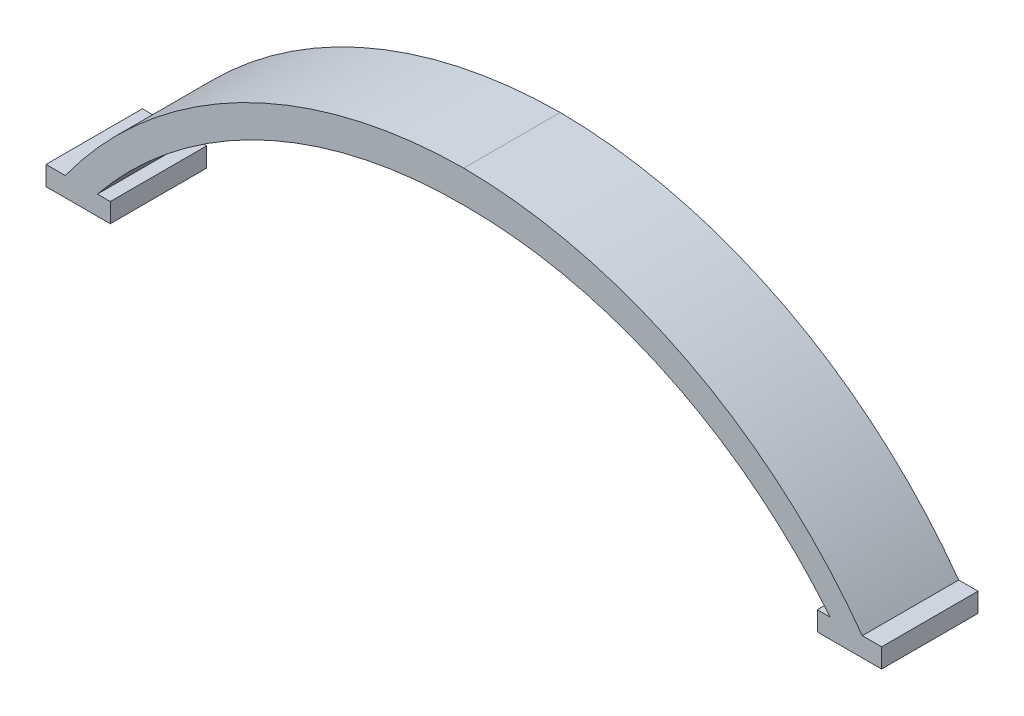
ISO-10303-21;
HEADER;
FILE_DESCRIPTION(('STEP AP214'),'2;1');
FILE_NAME('part.step','',(''),(''),'','','');
FILE_SCHEMA(('AUTOMOTIVE_DESIGN { 1 0 10303 214 1 1 1 1 }'));
ENDSEC;
DATA;
#1=APPLICATION_CONTEXT('core data for automotive mechanical design processes');
#2=APPLICATION_PROTOCOL_DEFINITION('international standard','automotive_design',2000,#1);
#3=PRODUCT_CONTEXT('',#1,'mechanical');
#4=PRODUCT('Part','Part','',(#3));
#5=PRODUCT_RELATED_PRODUCT_CATEGORY('part','',(#4));
#6=PRODUCT_DEFINITION_FORMATION('','',#4);
#7=PRODUCT_DEFINITION_CONTEXT('part definition',#1,'design');
#8=PRODUCT_DEFINITION('design','',#6,#7);
#9=PRODUCT_DEFINITION_SHAPE('','',#8);
#10=(LENGTH_UNIT() NAMED_UNIT(*) SI_UNIT(.MILLI.,.METRE.));
#11=(NAMED_UNIT(*) PLANE_ANGLE_UNIT() SI_UNIT($,.RADIAN.));
#12=(NAMED_UNIT(*) SI_UNIT($,.STERADIAN.) SOLID_ANGLE_UNIT());
#13=UNCERTAINTY_MEASURE_WITH_UNIT(LENGTH_MEASURE(1.E-05),#10,'distance_accuracy_value','');
#14=(GEOMETRIC_REPRESENTATION_CONTEXT(3) GLOBAL_UNCERTAINTY_ASSIGNED_CONTEXT((#13)) GLOBAL_UNIT_ASSIGNED_CONTEXT((#10,
#11,#12)) REPRESENTATION_CONTEXT('',''));
#15=CARTESIAN_POINT('',(0.,0.,0.));
#16=DIRECTION('',(0.,0.,1.));
#17=DIRECTION('',(1.,0.,0.));
#18=AXIS2_PLACEMENT_3D('',#15,#16,#17);
#19=CARTESIAN_POINT('',(0.,0.,19.05));
#20=DIRECTION('',(1.,0.,0.));
#21=DIRECTION('',(0.,0.,-1.));
#22=AXIS2_PLACEMENT_3D('',#19,#20,#21);
#23=PLANE('',#22);
#24=DIRECTION('',(0.,-1.,0.));
#25=VECTOR('',#24,1.);
#26=CARTESIAN_POINT('',(0.,0.,0.));
#27=LINE('',#26,#25);
#28=CARTESIAN_POINT('',(0.,3.81,0.));
#29=VERTEX_POINT('',#28);
#30=CARTESIAN_POINT('',(0.,0.,0.));
#31=VERTEX_POINT('',#30);
#32=EDGE_CURVE('E182',#29,#31,#27,.T.);
#33=ORIENTED_EDGE('',*,*,#32,.T.);
#34=DIRECTION('',(0.,0.,-1.));
#35=VECTOR('',#34,1.);
#36=CARTESIAN_POINT('',(0.,0.,19.05));
#37=LINE('',#36,#35);
#38=CARTESIAN_POINT('',(0.,0.,19.05));
#39=VERTEX_POINT('',#38);
#40=EDGE_CURVE('E11',#39,#31,#37,.T.);
#41=ORIENTED_EDGE('',*,*,#40,.F.);
#42=DIRECTION('',(0.,-1.,0.));
#43=VECTOR('',#42,1.);
#44=CARTESIAN_POINT('',(0.,0.,19.05));
#45=LINE('',#44,#43);
#46=CARTESIAN_POINT('',(0.,3.81,19.05));
#47=VERTEX_POINT('',#46);
#48=EDGE_CURVE('E222',#47,#39,#45,.T.);
#49=ORIENTED_EDGE('',*,*,#48,.F.);
#50=DIRECTION('',(0.,0.,-1.));
#51=VECTOR('',#50,1.);
#52=CARTESIAN_POINT('',(0.,3.81,19.05));
#53=LINE('',#52,#51);
#54=EDGE_CURVE('E178',#47,#29,#53,.T.);
#55=ORIENTED_EDGE('',*,*,#54,.T.);
#56=EDGE_LOOP('',(#33,#41,#49,#55));
#57=FACE_BOUND('',#56,.T.);
#58=ADVANCED_FACE('F45',(#57),#23,.F.);
#59=CARTESIAN_POINT('',(0.,0.,19.05));
#60=DIRECTION('',(0.,1.,0.));
#61=DIRECTION('',(0.,0.,1.));
#62=AXIS2_PLACEMENT_3D('',#59,#60,#61);
#63=PLANE('',#62);
#64=DIRECTION('',(1.,0.,0.));
#65=VECTOR('',#64,1.);
#66=CARTESIAN_POINT('',(0.,0.,0.));
#67=LINE('',#66,#65);
#68=CARTESIAN_POINT('',(12.7,0.,0.));
#69=VERTEX_POINT('',#68);
#70=EDGE_CURVE('E186',#31,#69,#67,.T.);
#71=ORIENTED_EDGE('',*,*,#70,.T.);
#72=DIRECTION('',(0.,0.,-1.));
#73=VECTOR('',#72,1.);
#74=CARTESIAN_POINT('',(12.7,0.,19.05));
#75=LINE('',#74,#73);
#76=CARTESIAN_POINT('',(12.7,0.,19.05));
#77=VERTEX_POINT('',#76);
#78=EDGE_CURVE('E54',#77,#69,#75,.T.);
#79=ORIENTED_EDGE('',*,*,#78,.F.);
#80=DIRECTION('',(1.,0.,0.));
#81=VECTOR('',#80,1.);
#82=CARTESIAN_POINT('',(0.,0.,19.05));
#83=LINE('',#82,#81);
#84=EDGE_CURVE('E123',#39,#77,#83,.T.);
#85=ORIENTED_EDGE('',*,*,#84,.F.);
#86=ORIENTED_EDGE('',*,*,#40,.T.);
#87=EDGE_LOOP('',(#71,#79,#85,#86));
#88=FACE_BOUND('',#87,.T.);
#89=ADVANCED_FACE('F330',(#88),#63,.F.);
#90=CARTESIAN_POINT('',(12.7,0.,19.05));
#91=DIRECTION('',(-1.,0.,0.));
#92=DIRECTION('',(0.,0.,1.));
#93=AXIS2_PLACEMENT_3D('',#90,#91,#92);
#94=PLANE('',#93);
#95=DIRECTION('',(0.,1.,0.));
#96=VECTOR('',#95,1.);
#97=CARTESIAN_POINT('',(12.7,0.,0.));
#98=LINE('',#97,#96);
#99=CARTESIAN_POINT('',(12.7,3.81,0.));
#100=VERTEX_POINT('',#99);
#101=EDGE_CURVE('E189',#69,#100,#98,.T.);
#102=ORIENTED_EDGE('',*,*,#101,.T.);
#103=DIRECTION('',(0.,0.,-1.));
#104=VECTOR('',#103,1.);
#105=CARTESIAN_POINT('',(12.7,3.81,19.05));
#106=LINE('',#105,#104);
#107=CARTESIAN_POINT('',(12.7,3.81,19.05));
#108=VERTEX_POINT('',#107);
#109=EDGE_CURVE('E257',#108,#100,#106,.T.);
#110=ORIENTED_EDGE('',*,*,#109,.F.);
#111=DIRECTION('',(0.,1.,0.));
#112=VECTOR('',#111,1.);
#113=CARTESIAN_POINT('',(12.7,0.,19.05));
#114=LINE('',#113,#112);
#115=EDGE_CURVE('E267',#77,#108,#114,.T.);
#116=ORIENTED_EDGE('',*,*,#115,.F.);
#117=ORIENTED_EDGE('',*,*,#78,.T.);
#118=EDGE_LOOP('',(#102,#110,#116,#117));
#119=FACE_BOUND('',#118,.T.);
#120=ADVANCED_FACE('F265',(#119),#94,.F.);
#121=CARTESIAN_POINT('',(12.7,3.81,19.05));
#122=DIRECTION('',(0.,-1.,0.));
#123=DIRECTION('',(1.,0.,0.));
#124=AXIS2_PLACEMENT_3D('',#121,#122,#123);
#125=PLANE('',#124);
#126=DIRECTION('',(-1.,0.,0.));
#127=VECTOR('',#126,1.);
#128=CARTESIAN_POINT('',(12.7,3.81,0.));
#129=LINE('',#128,#127);
#130=CARTESIAN_POINT('',(10.16,3.81,0.));
#131=VERTEX_POINT('',#130);
#132=EDGE_CURVE('E192',#100,#131,#129,.T.);
#133=ORIENTED_EDGE('',*,*,#132,.T.);
#134=DIRECTION('',(0.,0.,-1.));
#135=VECTOR('',#134,1.);
#136=CARTESIAN_POINT('',(10.16,3.81,19.05));
#137=LINE('',#136,#135);
#138=CARTESIAN_POINT('',(10.16,3.81,19.05));
#139=VERTEX_POINT('',#138);
#140=EDGE_CURVE('E253',#139,#131,#137,.T.);
#141=ORIENTED_EDGE('',*,*,#140,.F.);
#142=DIRECTION('',(-1.,0.,0.));
#143=VECTOR('',#142,1.);
#144=CARTESIAN_POINT('',(12.7,3.81,19.05));
#145=LINE('',#144,#143);
#146=EDGE_CURVE('E286',#108,#139,#145,.T.);
#147=ORIENTED_EDGE('',*,*,#146,.F.);
#148=ORIENTED_EDGE('',*,*,#109,.T.);
#149=EDGE_LOOP('',(#133,#141,#147,#148));
#150=FACE_BOUND('',#149,.T.);
#151=ADVANCED_FACE('F276',(#150),#125,.F.);
#152=CARTESIAN_POINT('',(81.9597219510219,-54.210524118824,19.05));
#153=DIRECTION('',(0.,0.,-1.));
#154=DIRECTION('',(-1.,0.,0.));
#155=AXIS2_PLACEMENT_3D('',#152,#153,#154);
#156=CYLINDRICAL_SURFACE('',#155,92.3124113609166);
#157=CARTESIAN_POINT('',(81.9597219510219,-54.210524118824,0.));
#158=DIRECTION('',(0.,0.,-1.));
#159=DIRECTION('',(-1.,0.,0.));
#160=AXIS2_PLACEMENT_3D('',#157,#158,#159);
#161=CIRCLE('',#160,92.3124113609166);
#162=CARTESIAN_POINT('',(82.55,38.1,0.));
#163=VERTEX_POINT('',#162);
#164=EDGE_CURVE('E195',#131,#163,#161,.T.);
#165=ORIENTED_EDGE('',*,*,#164,.T.);
#166=DIRECTION('',(0.,0.,-1.));
#167=VECTOR('',#166,1.);
#168=CARTESIAN_POINT('',(82.55,38.1,19.05));
#169=LINE('',#168,#167);
#170=CARTESIAN_POINT('',(82.55,38.1,19.05));
#171=VERTEX_POINT('',#170);
#172=EDGE_CURVE('E249',#171,#163,#169,.T.);
#173=ORIENTED_EDGE('',*,*,#172,.F.);
#174=CARTESIAN_POINT('',(81.9597219510219,-54.210524118824,19.05));
#175=DIRECTION('',(0.,0.,-1.));
#176=DIRECTION('',(-1.,0.,0.));
#177=AXIS2_PLACEMENT_3D('',#174,#175,#176);
#178=CIRCLE('',#177,92.3124113609166);
#179=EDGE_CURVE('E282',#139,#171,#178,.T.);
#180=ORIENTED_EDGE('',*,*,#179,.F.);
#181=ORIENTED_EDGE('',*,*,#140,.T.);
#182=EDGE_LOOP('',(#165,#173,#180,#181));
#183=FACE_BOUND('',#182,.T.);
#184=ADVANCED_FACE('F280',(#183),#156,.F.);
#185=CARTESIAN_POINT('',(83.1402780489781,-54.210524118824,19.05));
#186=DIRECTION('',(0.,0.,-1.));
#187=DIRECTION('',(-1.,0.,0.));
#188=AXIS2_PLACEMENT_3D('',#185,#186,#187);
#189=CYLINDRICAL_SURFACE('',#188,92.3124113609166);
#190=CARTESIAN_POINT('',(83.1402780489781,-54.210524118824,0.));
#191=DIRECTION('',(0.,0.,-1.));
#192=DIRECTION('',(1.,0.,0.));
#193=AXIS2_PLACEMENT_3D('',#190,#191,#192);
#194=CIRCLE('',#193,92.3124113609166);
#195=CARTESIAN_POINT('',(154.94,3.81,0.));
#196=VERTEX_POINT('',#195);
#197=EDGE_CURVE('E198',#163,#196,#194,.T.);
#198=ORIENTED_EDGE('',*,*,#197,.T.);
#199=DIRECTION('',(0.,0.,-1.));
#200=VECTOR('',#199,1.);
#201=CARTESIAN_POINT('',(154.94,3.81,19.05));
#202=LINE('',#201,#200);
#203=CARTESIAN_POINT('',(154.94,3.81,19.05));
#204=VERTEX_POINT('',#203);
#205=EDGE_CURVE('E245',#204,#196,#202,.T.);
#206=ORIENTED_EDGE('',*,*,#205,.F.);
#207=CARTESIAN_POINT('',(83.1402780489781,-54.210524118824,19.05));
#208=DIRECTION('',(0.,0.,-1.));
#209=DIRECTION('',(1.,0.,0.));
#210=AXIS2_PLACEMENT_3D('',#207,#208,#209);
#211=CIRCLE('',#210,92.3124113609166);
#212=EDGE_CURVE('E285',#171,#204,#211,.T.);
#213=ORIENTED_EDGE('',*,*,#212,.F.);
#214=ORIENTED_EDGE('',*,*,#172,.T.);
#215=EDGE_LOOP('',(#198,#206,#213,#214));
#216=FACE_BOUND('',#215,.T.);
#217=ADVANCED_FACE('F343',(#216),#189,.F.);
#218=CARTESIAN_POINT('',(152.4,3.81,19.05));
#219=DIRECTION('',(0.,-1.,0.));
#220=DIRECTION('',(1.,0.,0.));
#221=AXIS2_PLACEMENT_3D('',#218,#219,#220);
#222=PLANE('',#221);
#223=DIRECTION('',(-1.,0.,0.));
#224=VECTOR('',#223,1.);
#225=CARTESIAN_POINT('',(152.4,3.81,0.));
#226=LINE('',#225,#224);
#227=CARTESIAN_POINT('',(152.4,3.81,0.));
#228=VERTEX_POINT('',#227);
#229=EDGE_CURVE('E201',#196,#228,#226,.T.);
#230=ORIENTED_EDGE('',*,*,#229,.T.);
#231=DIRECTION('',(0.,0.,-1.));
#232=VECTOR('',#231,1.);
#233=CARTESIAN_POINT('',(152.4,3.81,19.05));
#234=LINE('',#233,#232);
#235=CARTESIAN_POINT('',(152.4,3.81,19.05));
#236=VERTEX_POINT('',#235);
#237=EDGE_CURVE('E241',#236,#228,#234,.T.);
#238=ORIENTED_EDGE('',*,*,#237,.F.);
#239=DIRECTION('',(-1.,0.,0.));
#240=VECTOR('',#239,1.);
#241=CARTESIAN_POINT('',(152.4,3.81,19.05));
#242=LINE('',#241,#240);
#243=EDGE_CURVE('E290',#204,#236,#242,.T.);
#244=ORIENTED_EDGE('',*,*,#243,.F.);
#245=ORIENTED_EDGE('',*,*,#205,.T.);
#246=EDGE_LOOP('',(#230,#238,#244,#245));
#247=FACE_BOUND('',#246,.T.);
#248=ADVANCED_FACE('F346',(#247),#222,.F.);
#249=CARTESIAN_POINT('',(152.4,0.,19.05));
#250=DIRECTION('',(1.,0.,0.));
#251=DIRECTION('',(0.,0.,-1.));
#252=AXIS2_PLACEMENT_3D('',#249,#250,#251);
#253=PLANE('',#252);
#254=DIRECTION('',(0.,-1.,0.));
#255=VECTOR('',#254,1.);
#256=CARTESIAN_POINT('',(152.4,0.,0.));
#257=LINE('',#256,#255);
#258=CARTESIAN_POINT('',(152.4,0.,0.));
#259=VERTEX_POINT('',#258);
#260=EDGE_CURVE('E204',#228,#259,#257,.T.);
#261=ORIENTED_EDGE('',*,*,#260,.T.);
#262=DIRECTION('',(0.,0.,-1.));
#263=VECTOR('',#262,1.);
#264=CARTESIAN_POINT('',(152.4,0.,19.05));
#265=LINE('',#264,#263);
#266=CARTESIAN_POINT('',(152.4,0.,19.05));
#267=VERTEX_POINT('',#266);
#268=EDGE_CURVE('E237',#267,#259,#265,.T.);
#269=ORIENTED_EDGE('',*,*,#268,.F.);
#270=DIRECTION('',(0.,-1.,0.));
#271=VECTOR('',#270,1.);
#272=CARTESIAN_POINT('',(152.4,0.,19.05));
#273=LINE('',#272,#271);
#274=EDGE_CURVE('E297',#236,#267,#273,.T.);
#275=ORIENTED_EDGE('',*,*,#274,.F.);
#276=ORIENTED_EDGE('',*,*,#237,.T.);
#277=EDGE_LOOP('',(#261,#269,#275,#276));
#278=FACE_BOUND('',#277,.T.);
#279=ADVANCED_FACE('F350',(#278),#253,.F.);
#280=CARTESIAN_POINT('',(165.1,0.,19.05));
#281=DIRECTION('',(0.,1.,0.));
#282=DIRECTION('',(0.,0.,1.));
#283=AXIS2_PLACEMENT_3D('',#280,#281,#282);
#284=PLANE('',#283);
#285=DIRECTION('',(1.,0.,0.));
#286=VECTOR('',#285,1.);
#287=CARTESIAN_POINT('',(165.1,0.,0.));
#288=LINE('',#287,#286);
#289=CARTESIAN_POINT('',(165.1,0.,0.));
#290=VERTEX_POINT('',#289);
#291=EDGE_CURVE('E207',#259,#290,#288,.T.);
#292=ORIENTED_EDGE('',*,*,#291,.T.);
#293=DIRECTION('',(0.,0.,-1.));
#294=VECTOR('',#293,1.);
#295=CARTESIAN_POINT('',(165.1,0.,19.05));
#296=LINE('',#295,#294);
#297=CARTESIAN_POINT('',(165.1,0.,19.05));
#298=VERTEX_POINT('',#297);
#299=EDGE_CURVE('E233',#298,#290,#296,.T.);
#300=ORIENTED_EDGE('',*,*,#299,.F.);
#301=DIRECTION('',(1.,0.,0.));
#302=VECTOR('',#301,1.);
#303=CARTESIAN_POINT('',(165.1,0.,19.05));
#304=LINE('',#303,#302);
#305=EDGE_CURVE('E300',#267,#298,#304,.T.);
#306=ORIENTED_EDGE('',*,*,#305,.F.);
#307=ORIENTED_EDGE('',*,*,#268,.T.);
#308=EDGE_LOOP('',(#292,#300,#306,#307));
#309=FACE_BOUND('',#308,.T.);
#310=ADVANCED_FACE('F354',(#309),#284,.F.);
#311=CARTESIAN_POINT('',(165.1,0.,19.05));
#312=DIRECTION('',(-1.,0.,0.));
#313=DIRECTION('',(0.,0.,1.));
#314=AXIS2_PLACEMENT_3D('',#311,#312,#313);
#315=PLANE('',#314);
#316=DIRECTION('',(0.,1.,0.));
#317=VECTOR('',#316,1.);
#318=CARTESIAN_POINT('',(165.1,0.,0.));
#319=LINE('',#318,#317);
#320=CARTESIAN_POINT('',(165.1,3.81,0.));
#321=VERTEX_POINT('',#320);
#322=EDGE_CURVE('E210',#290,#321,#319,.T.);
#323=ORIENTED_EDGE('',*,*,#322,.T.);
#324=DIRECTION('',(0.,0.,-1.));
#325=VECTOR('',#324,1.);
#326=CARTESIAN_POINT('',(165.1,3.81,19.05));
#327=LINE('',#326,#325);
#328=CARTESIAN_POINT('',(165.1,3.81,19.05));
#329=VERTEX_POINT('',#328);
#330=EDGE_CURVE('E229',#329,#321,#327,.T.);
#331=ORIENTED_EDGE('',*,*,#330,.F.);
#332=DIRECTION('',(0.,1.,0.));
#333=VECTOR('',#332,1.);
#334=CARTESIAN_POINT('',(165.1,0.,19.05));
#335=LINE('',#334,#333);
#336=EDGE_CURVE('E303',#298,#329,#335,.T.);
#337=ORIENTED_EDGE('',*,*,#336,.F.);
#338=ORIENTED_EDGE('',*,*,#299,.T.);
#339=EDGE_LOOP('',(#323,#331,#337,#338));
#340=FACE_BOUND('',#339,.T.);
#341=ADVANCED_FACE('F311',(#340),#315,.F.);
#342=CARTESIAN_POINT('',(165.1,3.81,19.05));
#343=DIRECTION('',(0.,-1.,0.));
#344=DIRECTION('',(0.,0.,-1.));
#345=AXIS2_PLACEMENT_3D('',#342,#343,#344);
#346=PLANE('',#345);
#347=DIRECTION('',(-1.,0.,0.));
#348=VECTOR('',#347,1.);
#349=CARTESIAN_POINT('',(165.1,3.81,0.));
#350=LINE('',#349,#348);
#351=CARTESIAN_POINT('',(161.29,3.81,0.));
#352=VERTEX_POINT('',#351);
#353=EDGE_CURVE('E213',#321,#352,#350,.T.);
#354=ORIENTED_EDGE('',*,*,#353,.T.);
#355=DIRECTION('',(0.,0.,-1.));
#356=VECTOR('',#355,1.);
#357=CARTESIAN_POINT('',(161.29,3.81,19.05));
#358=LINE('',#357,#356);
#359=CARTESIAN_POINT('',(161.29,3.81,19.05));
#360=VERTEX_POINT('',#359);
#361=EDGE_CURVE('E171',#360,#352,#358,.T.);
#362=ORIENTED_EDGE('',*,*,#361,.F.);
#363=DIRECTION('',(-1.,0.,0.));
#364=VECTOR('',#363,1.);
#365=CARTESIAN_POINT('',(165.1,3.81,19.05));
#366=LINE('',#365,#364);
#367=EDGE_CURVE('E160',#329,#360,#366,.T.);
#368=ORIENTED_EDGE('',*,*,#367,.F.);
#369=ORIENTED_EDGE('',*,*,#330,.T.);
#370=EDGE_LOOP('',(#354,#362,#368,#369));
#371=FACE_BOUND('',#370,.T.);
#372=ADVANCED_FACE('F315',(#371),#346,.F.);
#373=CARTESIAN_POINT('',(81.882169446802,-53.4432966968212,19.05));
#374=DIRECTION('',(0.,0.,-1.));
#375=DIRECTION('',(-1.,0.,0.));
#376=AXIS2_PLACEMENT_3D('',#373,#374,#375);
#377=CYLINDRICAL_SURFACE('',#376,97.8955746488044);
#378=CARTESIAN_POINT('',(81.882169446802,-53.4432966968212,0.));
#379=DIRECTION('',(0.,0.,1.));
#380=DIRECTION('',(1.,0.,0.));
#381=AXIS2_PLACEMENT_3D('',#378,#379,#380);
#382=CIRCLE('',#381,97.8955746488044);
#383=CARTESIAN_POINT('',(82.55,44.45,0.));
#384=VERTEX_POINT('',#383);
#385=EDGE_CURVE('E169',#352,#384,#382,.T.);
#386=ORIENTED_EDGE('',*,*,#385,.T.);
#387=DIRECTION('',(0.,0.,-1.));
#388=VECTOR('',#387,1.);
#389=CARTESIAN_POINT('',(82.55,44.45,19.05));
#390=LINE('',#389,#388);
#391=CARTESIAN_POINT('',(82.55,44.45,19.05));
#392=VERTEX_POINT('',#391);
#393=EDGE_CURVE('E166',#392,#384,#390,.T.);
#394=ORIENTED_EDGE('',*,*,#393,.F.);
#395=CARTESIAN_POINT('',(81.882169446802,-53.4432966968212,19.05));
#396=DIRECTION('',(0.,0.,1.));
#397=DIRECTION('',(1.,0.,0.));
#398=AXIS2_PLACEMENT_3D('',#395,#396,#397);
#399=CIRCLE('',#398,97.8955746488044);
#400=EDGE_CURVE('E154',#360,#392,#399,.T.);
#401=ORIENTED_EDGE('',*,*,#400,.F.);
#402=ORIENTED_EDGE('',*,*,#361,.T.);
#403=EDGE_LOOP('',(#386,#394,#401,#402));
#404=FACE_BOUND('',#403,.T.);
#405=ADVANCED_FACE('F167',(#404),#377,.T.);
#406=CARTESIAN_POINT('',(83.217830553198,-53.4432966968212,19.05));
#407=DIRECTION('',(0.,0.,-1.));
#408=DIRECTION('',(-1.,0.,0.));
#409=AXIS2_PLACEMENT_3D('',#406,#407,#408);
#410=CYLINDRICAL_SURFACE('',#409,97.8955746488044);
#411=CARTESIAN_POINT('',(83.217830553198,-53.4432966968212,0.));
#412=DIRECTION('',(0.,0.,1.));
#413=DIRECTION('',(-1.,0.,0.));
#414=AXIS2_PLACEMENT_3D('',#411,#412,#413);
#415=CIRCLE('',#414,97.8955746488044);
#416=CARTESIAN_POINT('',(3.80999999999999,3.81,0.));
#417=VERTEX_POINT('',#416);
#418=EDGE_CURVE('E109',#384,#417,#415,.T.);
#419=ORIENTED_EDGE('',*,*,#418,.T.);
#420=DIRECTION('',(0.,0.,-1.));
#421=VECTOR('',#420,1.);
#422=CARTESIAN_POINT('',(3.80999999999999,3.81,19.05));
#423=LINE('',#422,#421);
#424=CARTESIAN_POINT('',(3.80999999999999,3.81,19.05));
#425=VERTEX_POINT('',#424);
#426=EDGE_CURVE('E172',#425,#417,#423,.T.);
#427=ORIENTED_EDGE('',*,*,#426,.F.);
#428=CARTESIAN_POINT('',(83.217830553198,-53.4432966968212,19.05));
#429=DIRECTION('',(0.,0.,1.));
#430=DIRECTION('',(-1.,0.,0.));
#431=AXIS2_PLACEMENT_3D('',#428,#429,#430);
#432=CIRCLE('',#431,97.8955746488044);
#433=EDGE_CURVE('E158',#392,#425,#432,.T.);
#434=ORIENTED_EDGE('',*,*,#433,.F.);
#435=ORIENTED_EDGE('',*,*,#393,.T.);
#436=EDGE_LOOP('',(#419,#427,#434,#435));
#437=FACE_BOUND('',#436,.T.);
#438=ADVANCED_FACE('F174',(#437),#410,.T.);
#439=CARTESIAN_POINT('',(0.,3.81,19.05));
#440=DIRECTION('',(0.,-1.,0.));
#441=DIRECTION('',(0.,0.,-1.));
#442=AXIS2_PLACEMENT_3D('',#439,#440,#441);
#443=PLANE('',#442);
#444=DIRECTION('',(-1.,0.,0.));
#445=VECTOR('',#444,1.);
#446=CARTESIAN_POINT('',(0.,3.81,0.));
#447=LINE('',#446,#445);
#448=EDGE_CURVE('E115',#417,#29,#447,.T.);
#449=ORIENTED_EDGE('',*,*,#448,.T.);
#450=ORIENTED_EDGE('',*,*,#54,.F.);
#451=DIRECTION('',(-1.,0.,0.));
#452=VECTOR('',#451,1.);
#453=CARTESIAN_POINT('',(0.,3.81,19.05));
#454=LINE('',#453,#452);
#455=EDGE_CURVE('E62',#425,#47,#454,.T.);
#456=ORIENTED_EDGE('',*,*,#455,.F.);
#457=ORIENTED_EDGE('',*,*,#426,.T.);
#458=EDGE_LOOP('',(#449,#450,#456,#457));
#459=FACE_BOUND('',#458,.T.);
#460=ADVANCED_FACE('F319',(#459),#443,.F.);
#461=CARTESIAN_POINT('',(83.217830553198,-53.4432966968212,19.05));
#462=DIRECTION('',(0.,0.,-1.));
#463=DIRECTION('',(-1.,0.,0.));
#464=AXIS2_PLACEMENT_3D('',#461,#462,#463);
#465=PLANE('',#464);
#466=ORIENTED_EDGE('',*,*,#48,.T.);
#467=ORIENTED_EDGE('',*,*,#84,.T.);
#468=ORIENTED_EDGE('',*,*,#115,.T.);
#469=ORIENTED_EDGE('',*,*,#146,.T.);
#470=ORIENTED_EDGE('',*,*,#179,.T.);
#471=ORIENTED_EDGE('',*,*,#212,.T.);
#472=ORIENTED_EDGE('',*,*,#243,.T.);
#473=ORIENTED_EDGE('',*,*,#274,.T.);
#474=ORIENTED_EDGE('',*,*,#305,.T.);
#475=ORIENTED_EDGE('',*,*,#336,.T.);
#476=ORIENTED_EDGE('',*,*,#367,.T.);
#477=ORIENTED_EDGE('',*,*,#400,.T.);
#478=ORIENTED_EDGE('',*,*,#433,.T.);
#479=ORIENTED_EDGE('',*,*,#455,.T.);
#480=EDGE_LOOP('',(#466,#467,#468,#469,#470,#471,#472,#473,#474,#475,#476,#477,#478,#479));
#481=FACE_BOUND('',#480,.T.);
#482=ADVANCED_FACE('F156',(#481),#465,.F.);
#483=CARTESIAN_POINT('',(83.217830553198,-53.4432966968212,0.));
#484=DIRECTION('',(0.,0.,-1.));
#485=DIRECTION('',(-1.,0.,0.));
#486=AXIS2_PLACEMENT_3D('',#483,#484,#485);
#487=PLANE('',#486);
#488=ORIENTED_EDGE('',*,*,#32,.F.);
#489=ORIENTED_EDGE('',*,*,#448,.F.);
#490=ORIENTED_EDGE('',*,*,#418,.F.);
#491=ORIENTED_EDGE('',*,*,#385,.F.);
#492=ORIENTED_EDGE('',*,*,#353,.F.);
#493=ORIENTED_EDGE('',*,*,#322,.F.);
#494=ORIENTED_EDGE('',*,*,#291,.F.);
#495=ORIENTED_EDGE('',*,*,#260,.F.);
#496=ORIENTED_EDGE('',*,*,#229,.F.);
#497=ORIENTED_EDGE('',*,*,#197,.F.);
#498=ORIENTED_EDGE('',*,*,#164,.F.);
#499=ORIENTED_EDGE('',*,*,#132,.F.);
#500=ORIENTED_EDGE('',*,*,#101,.F.);
#501=ORIENTED_EDGE('',*,*,#70,.F.);
#502=EDGE_LOOP('',(#488,#489,#490,#491,#492,#493,#494,#495,#496,#497,#498,#499,#500,#501));
#503=FACE_BOUND('',#502,.T.);
#504=ADVANCED_FACE('F271',(#503),#487,.T.);
#505=CLOSED_SHELL('',(#58,#89,#120,#151,#184,#217,#248,#279,#310,#341,#372,#405,#438,#460,#482,#504));
#506=MANIFOLD_SOLID_BREP('B2',#505);
#507=ADVANCED_BREP_SHAPE_REPRESENTATION('',(#18,#506),#14);
#508=SHAPE_DEFINITION_REPRESENTATION(#9,#507);
ENDSEC;
END-ISO-10303-21;
